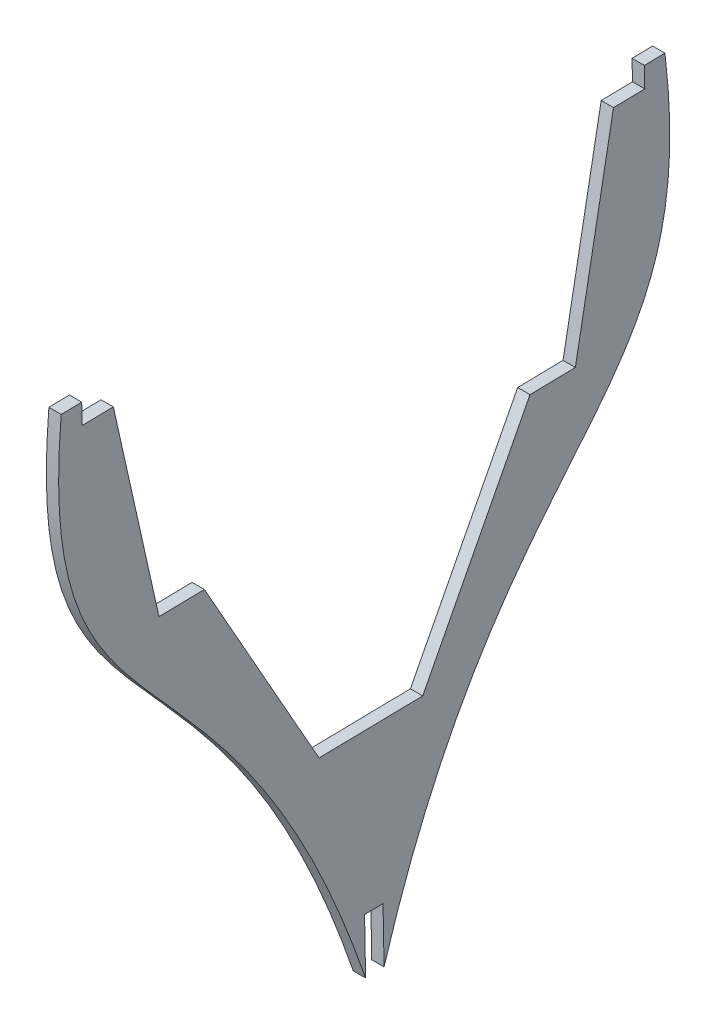
ISO-10303-21;
HEADER;
FILE_DESCRIPTION(('STEP AP214'),'2;1');
FILE_NAME('part.step','',(''),(''),'','','');
FILE_SCHEMA(('AUTOMOTIVE_DESIGN { 1 0 10303 214 1 1 1 1 }'));
ENDSEC;
DATA;
#1=APPLICATION_CONTEXT('core data for automotive mechanical design processes');
#2=APPLICATION_PROTOCOL_DEFINITION('international standard','automotive_design',2000,#1);
#3=PRODUCT_CONTEXT('',#1,'mechanical');
#4=PRODUCT('Part','Part','',(#3));
#5=PRODUCT_RELATED_PRODUCT_CATEGORY('part','',(#4));
#6=PRODUCT_DEFINITION_FORMATION('','',#4);
#7=PRODUCT_DEFINITION_CONTEXT('part definition',#1,'design');
#8=PRODUCT_DEFINITION('design','',#6,#7);
#9=PRODUCT_DEFINITION_SHAPE('','',#8);
#10=(LENGTH_UNIT() NAMED_UNIT(*) SI_UNIT(.MILLI.,.METRE.));
#11=(NAMED_UNIT(*) PLANE_ANGLE_UNIT() SI_UNIT($,.RADIAN.));
#12=(NAMED_UNIT(*) SI_UNIT($,.STERADIAN.) SOLID_ANGLE_UNIT());
#13=UNCERTAINTY_MEASURE_WITH_UNIT(LENGTH_MEASURE(1.E-05),#10,'distance_accuracy_value','');
#14=(GEOMETRIC_REPRESENTATION_CONTEXT(3) GLOBAL_UNCERTAINTY_ASSIGNED_CONTEXT((#13)) GLOBAL_UNIT_ASSIGNED_CONTEXT((#10,
#11,#12)) REPRESENTATION_CONTEXT('',''));
#15=CARTESIAN_POINT('',(0.,0.,0.));
#16=DIRECTION('',(0.,0.,1.));
#17=DIRECTION('',(1.,0.,0.));
#18=AXIS2_PLACEMENT_3D('',#15,#16,#17);
#19=CARTESIAN_POINT('',(6.,355.378099814602,153.581088809541));
#20=CARTESIAN_POINT('',(6.,198.734001520713,166.999417296448));
#21=CARTESIAN_POINT('',(6.,241.756512810065,68.4977827661735));
#22=CARTESIAN_POINT('',(6.,29.1018574836291,0.530415896047852));
#23=B_SPLINE_CURVE_WITH_KNOTS('',3,(#19,#20,#21,#22),.UNSPECIFIED.,.F.,.F.,(4,4),(0.,1.),.UNSPECIFIED.);
#24=DIRECTION('',(-1.,0.,0.));
#25=VECTOR('',#24,1.);
#26=SURFACE_OF_LINEAR_EXTRUSION('',#23,#25);
#27=CARTESIAN_POINT('',(0.,355.378099814602,153.581088809541));
#28=CARTESIAN_POINT('',(0.,198.734001520713,166.999417296448));
#29=CARTESIAN_POINT('',(0.,241.756512810065,68.4977827661735));
#30=CARTESIAN_POINT('',(0.,29.1018574836291,0.530415896047852));
#31=B_SPLINE_CURVE_WITH_KNOTS('',3,(#27,#28,#29,#30),.UNSPECIFIED.,.F.,.F.,(4,4),(0.,1.),.UNSPECIFIED.);
#32=CARTESIAN_POINT('',(0.,355.378099814602,153.581088809541));
#33=VERTEX_POINT('',#32);
#34=CARTESIAN_POINT('',(0.,43.4519092016995,5.29345749439015));
#35=VERTEX_POINT('',#34);
#36=EDGE_CURVE('E179',#33,#35,#31,.T.);
#37=ORIENTED_EDGE('',*,*,#36,.T.);
#38=DIRECTION('',(1.,0.,0.));
#39=VECTOR('',#38,1.);
#40=CARTESIAN_POINT('',(0.,43.4519092016995,5.29345749439015));
#41=LINE('',#40,#39);
#42=CARTESIAN_POINT('',(6.,43.4519092016995,5.29345749439015));
#43=VERTEX_POINT('',#42);
#44=EDGE_CURVE('E185',#35,#43,#41,.T.);
#45=ORIENTED_EDGE('',*,*,#44,.T.);
#46=CARTESIAN_POINT('',(6.,355.378099814602,153.581088809541));
#47=VERTEX_POINT('',#46);
#48=EDGE_CURVE('E219',#47,#43,#23,.T.);
#49=ORIENTED_EDGE('',*,*,#48,.F.);
#50=DIRECTION('',(-1.,0.,0.));
#51=VECTOR('',#50,1.);
#52=CARTESIAN_POINT('',(6.,355.378099814602,153.581088809541));
#53=LINE('',#52,#51);
#54=EDGE_CURVE('E175',#47,#33,#53,.T.);
#55=ORIENTED_EDGE('',*,*,#54,.T.);
#56=EDGE_LOOP('',(#37,#45,#49,#55));
#57=FACE_BOUND('',#56,.T.);
#58=ADVANCED_FACE('F33',(#57),#26,.F.);
#59=CARTESIAN_POINT('',(6.,29.1018574836291,0.530415896047852));
#60=CARTESIAN_POINT('',(6.,244.092023687061,-59.6426164945832));
#61=CARTESIAN_POINT('',(6.,204.687512569235,-159.646581347699));
#62=CARTESIAN_POINT('',(6.,360.738605502558,-140.529011836815));
#63=B_SPLINE_CURVE_WITH_KNOTS('',3,(#59,#60,#61,#62),.UNSPECIFIED.,.F.,.F.,(4,4),(0.,1.),.UNSPECIFIED.);
#64=DIRECTION('',(-1.,0.,0.));
#65=VECTOR('',#64,1.);
#66=SURFACE_OF_LINEAR_EXTRUSION('',#63,#65);
#67=CARTESIAN_POINT('',(6.,43.6159448845461,-3.70654250560984));
#68=VERTEX_POINT('',#67);
#69=CARTESIAN_POINT('',(6.,360.738605502558,-140.529011836815));
#70=VERTEX_POINT('',#69);
#71=EDGE_CURVE('E116',#68,#70,#63,.T.);
#72=ORIENTED_EDGE('',*,*,#71,.F.);
#73=DIRECTION('',(1.,0.,0.));
#74=VECTOR('',#73,1.);
#75=CARTESIAN_POINT('',(0.,43.6159448845461,-3.70654250560984));
#76=LINE('',#75,#74);
#77=CARTESIAN_POINT('',(0.,43.6159448845461,-3.70654250560984));
#78=VERTEX_POINT('',#77);
#79=EDGE_CURVE('E311',#78,#68,#76,.T.);
#80=ORIENTED_EDGE('',*,*,#79,.F.);
#81=CARTESIAN_POINT('',(0.,29.1018574836291,0.530415896047852));
#82=CARTESIAN_POINT('',(0.,244.092023687061,-59.6426164945832));
#83=CARTESIAN_POINT('',(0.,204.687512569235,-159.646581347699));
#84=CARTESIAN_POINT('',(0.,360.738605502558,-140.529011836815));
#85=B_SPLINE_CURVE_WITH_KNOTS('',3,(#81,#82,#83,#84),.UNSPECIFIED.,.F.,.F.,(4,4),(0.,1.),.UNSPECIFIED.);
#86=CARTESIAN_POINT('',(0.,360.738605502558,-140.529011836815));
#87=VERTEX_POINT('',#86);
#88=EDGE_CURVE('E184',#78,#87,#85,.T.);
#89=ORIENTED_EDGE('',*,*,#88,.T.);
#90=DIRECTION('',(-1.,0.,0.));
#91=VECTOR('',#90,1.);
#92=CARTESIAN_POINT('',(6.,360.738605502558,-140.529011836815));
#93=LINE('',#92,#91);
#94=EDGE_CURVE('E11',#70,#87,#93,.T.);
#95=ORIENTED_EDGE('',*,*,#94,.F.);
#96=EDGE_LOOP('',(#72,#80,#89,#95));
#97=FACE_BOUND('',#96,.T.);
#98=ADVANCED_FACE('F323',(#97),#66,.F.);
#99=CARTESIAN_POINT('',(6.,360.738605502558,-140.529011836815));
#100=DIRECTION('',(0.,-0.999833944424872,-0.0182231604229995));
#101=DIRECTION('',(0.,0.0182231604229995,-0.999833944424872));
#102=AXIS2_PLACEMENT_3D('',#99,#100,#101);
#103=PLANE('',#102);
#104=DIRECTION('',(0.,-0.0182231604229995,0.999833944424872));
#105=VECTOR('',#104,1.);
#106=CARTESIAN_POINT('',(0.,360.738605502558,-140.529011836815));
#107=LINE('',#106,#105);
#108=CARTESIAN_POINT('',(0.,360.556343632728,-130.529011836815));
#109=VERTEX_POINT('',#108);
#110=EDGE_CURVE('E192',#87,#109,#107,.T.);
#111=ORIENTED_EDGE('',*,*,#110,.T.);
#112=DIRECTION('',(-1.,0.,0.));
#113=VECTOR('',#112,1.);
#114=CARTESIAN_POINT('',(6.,360.556343632728,-130.529011836815));
#115=LINE('',#114,#113);
#116=CARTESIAN_POINT('',(6.,360.556343632728,-130.529011836815));
#117=VERTEX_POINT('',#116);
#118=EDGE_CURVE('E41',#117,#109,#115,.T.);
#119=ORIENTED_EDGE('',*,*,#118,.F.);
#120=DIRECTION('',(0.,-0.0182231604229995,0.999833944424872));
#121=VECTOR('',#120,1.);
#122=CARTESIAN_POINT('',(6.,360.738605502558,-140.529011836815));
#123=LINE('',#122,#121);
#124=EDGE_CURVE('E305',#70,#117,#123,.T.);
#125=ORIENTED_EDGE('',*,*,#124,.F.);
#126=ORIENTED_EDGE('',*,*,#94,.T.);
#127=EDGE_LOOP('',(#111,#119,#125,#126));
#128=FACE_BOUND('',#127,.T.);
#129=ADVANCED_FACE('F326',(#128),#103,.F.);
#130=CARTESIAN_POINT('',(6.,360.556343632728,-130.529011836815));
#131=DIRECTION('',(0.,0.0182231604229912,-0.999833944424872));
#132=DIRECTION('',(0.,0.999833944424872,0.0182231604229912));
#133=AXIS2_PLACEMENT_3D('',#130,#131,#132);
#134=PLANE('',#133);
#135=DIRECTION('',(0.,-0.999833944424872,-0.0182231604229912));
#136=VECTOR('',#135,1.);
#137=CARTESIAN_POINT('',(0.,360.556343632728,-130.529011836815));
#138=LINE('',#137,#136);
#139=CARTESIAN_POINT('',(0.,350.556343632728,-130.711273706644));
#140=VERTEX_POINT('',#139);
#141=EDGE_CURVE('E197',#109,#140,#138,.T.);
#142=ORIENTED_EDGE('',*,*,#141,.T.);
#143=DIRECTION('',(-1.,0.,0.));
#144=VECTOR('',#143,1.);
#145=CARTESIAN_POINT('',(6.,350.556343632728,-130.711273706644));
#146=LINE('',#145,#144);
#147=CARTESIAN_POINT('',(6.,350.556343632728,-130.711273706644));
#148=VERTEX_POINT('',#147);
#149=EDGE_CURVE('E244',#148,#140,#146,.T.);
#150=ORIENTED_EDGE('',*,*,#149,.F.);
#151=DIRECTION('',(0.,-0.999833944424872,-0.0182231604229912));
#152=VECTOR('',#151,1.);
#153=CARTESIAN_POINT('',(6.,360.556343632728,-130.529011836815));
#154=LINE('',#153,#152);
#155=EDGE_CURVE('E253',#117,#148,#154,.T.);
#156=ORIENTED_EDGE('',*,*,#155,.F.);
#157=ORIENTED_EDGE('',*,*,#118,.T.);
#158=EDGE_LOOP('',(#142,#150,#156,#157));
#159=FACE_BOUND('',#158,.T.);
#160=ADVANCED_FACE('F251',(#159),#134,.F.);
#161=CARTESIAN_POINT('',(6.,350.556343632728,-130.711273706644));
#162=DIRECTION('',(0.,-0.999833944424872,-0.0182231604229842));
#163=DIRECTION('',(0.,0.0182231604229842,-0.999833944424872));
#164=AXIS2_PLACEMENT_3D('',#161,#162,#163);
#165=PLANE('',#164);
#166=DIRECTION('',(0.,-0.0182231604229842,0.999833944424872));
#167=VECTOR('',#166,1.);
#168=CARTESIAN_POINT('',(0.,350.556343632728,-130.711273706644));
#169=LINE('',#168,#167);
#170=CARTESIAN_POINT('',(0.,350.278767510279,-115.481751332674));
#171=VERTEX_POINT('',#170);
#172=EDGE_CURVE('E199',#140,#171,#169,.T.);
#173=ORIENTED_EDGE('',*,*,#172,.T.);
#174=DIRECTION('',(-1.,0.,0.));
#175=VECTOR('',#174,1.);
#176=CARTESIAN_POINT('',(6.,350.278767510279,-115.481751332674));
#177=LINE('',#176,#175);
#178=CARTESIAN_POINT('',(6.,350.278767510279,-115.481751332674));
#179=VERTEX_POINT('',#178);
#180=EDGE_CURVE('E241',#179,#171,#177,.T.);
#181=ORIENTED_EDGE('',*,*,#180,.F.);
#182=DIRECTION('',(0.,-0.0182231604229842,0.999833944424872));
#183=VECTOR('',#182,1.);
#184=CARTESIAN_POINT('',(6.,350.556343632728,-130.711273706644));
#185=LINE('',#184,#183);
#186=EDGE_CURVE('E275',#148,#179,#185,.T.);
#187=ORIENTED_EDGE('',*,*,#186,.F.);
#188=ORIENTED_EDGE('',*,*,#149,.T.);
#189=EDGE_LOOP('',(#173,#181,#187,#188));
#190=FACE_BOUND('',#189,.T.);
#191=ADVANCED_FACE('F266',(#190),#165,.F.);
#192=CARTESIAN_POINT('',(6.,350.278767510279,-115.481751332674));
#193=DIRECTION('',(0.,-0.182055173192639,-0.983288316778857));
#194=DIRECTION('',(0.,0.983288316778857,-0.182055173192639));
#195=AXIS2_PLACEMENT_3D('',#192,#193,#194);
#196=PLANE('',#195);
#197=DIRECTION('',(0.,-0.983288316778857,0.182055173192639));
#198=VECTOR('',#197,1.);
#199=CARTESIAN_POINT('',(0.,350.278767510279,-115.481751332674));
#200=LINE('',#199,#198);
#201=CARTESIAN_POINT('',(0.,249.923503702483,-96.9010414619696));
#202=VERTEX_POINT('',#201);
#203=EDGE_CURVE('E201',#171,#202,#200,.T.);
#204=ORIENTED_EDGE('',*,*,#203,.T.);
#205=DIRECTION('',(-1.,0.,0.));
#206=VECTOR('',#205,1.);
#207=CARTESIAN_POINT('',(6.,249.923503702483,-96.9010414619696));
#208=LINE('',#207,#206);
#209=CARTESIAN_POINT('',(6.,249.923503702483,-96.9010414619696));
#210=VERTEX_POINT('',#209);
#211=EDGE_CURVE('E238',#210,#202,#208,.T.);
#212=ORIENTED_EDGE('',*,*,#211,.F.);
#213=DIRECTION('',(0.,-0.983288316778857,0.182055173192639));
#214=VECTOR('',#213,1.);
#215=CARTESIAN_POINT('',(6.,350.278767510279,-115.481751332674));
#216=LINE('',#215,#214);
#217=EDGE_CURVE('E272',#179,#210,#216,.T.);
#218=ORIENTED_EDGE('',*,*,#217,.F.);
#219=ORIENTED_EDGE('',*,*,#180,.T.);
#220=EDGE_LOOP('',(#204,#212,#218,#219));
#221=FACE_BOUND('',#220,.T.);
#222=ADVANCED_FACE('F270',(#221),#196,.F.);
#223=CARTESIAN_POINT('',(6.,249.923503702483,-96.9010414619696));
#224=DIRECTION('',(0.,-0.999833944424872,-0.0182231604229948));
#225=DIRECTION('',(0.,0.0182231604229948,-0.999833944424872));
#226=AXIS2_PLACEMENT_3D('',#223,#224,#225);
#227=PLANE('',#226);
#228=DIRECTION('',(0.,-0.0182231604229948,0.999833944424872));
#229=VECTOR('',#228,1.);
#230=CARTESIAN_POINT('',(0.,249.923503702483,-96.9010414619696));
#231=LINE('',#230,#229);
#232=CARTESIAN_POINT('',(0.,249.520283779664,-74.7779323773996));
#233=VERTEX_POINT('',#232);
#234=EDGE_CURVE('E203',#202,#233,#231,.T.);
#235=ORIENTED_EDGE('',*,*,#234,.T.);
#236=DIRECTION('',(-1.,0.,0.));
#237=VECTOR('',#236,1.);
#238=CARTESIAN_POINT('',(6.,249.520283779664,-74.7779323773996));
#239=LINE('',#238,#237);
#240=CARTESIAN_POINT('',(6.,249.520283779664,-74.7779323773996));
#241=VERTEX_POINT('',#240);
#242=EDGE_CURVE('E235',#241,#233,#239,.T.);
#243=ORIENTED_EDGE('',*,*,#242,.F.);
#244=DIRECTION('',(0.,-0.0182231604229948,0.999833944424872));
#245=VECTOR('',#244,1.);
#246=CARTESIAN_POINT('',(6.,249.923503702483,-96.9010414619696));
#247=LINE('',#246,#245);
#248=EDGE_CURVE('E274',#210,#241,#247,.T.);
#249=ORIENTED_EDGE('',*,*,#248,.F.);
#250=ORIENTED_EDGE('',*,*,#211,.T.);
#251=EDGE_LOOP('',(#235,#243,#249,#250));
#252=FACE_BOUND('',#251,.T.);
#253=ADVANCED_FACE('F336',(#252),#227,.F.);
#254=CARTESIAN_POINT('',(6.,249.520283779664,-74.7779323773996));
#255=DIRECTION('',(0.,-0.45948594700903,-0.888185039561698));
#256=DIRECTION('',(0.,0.888185039561698,-0.45948594700903));
#257=AXIS2_PLACEMENT_3D('',#254,#255,#256);
#258=PLANE('',#257);
#259=DIRECTION('',(0.,-0.888185039561698,0.45948594700903));
#260=VECTOR('',#259,1.);
#261=CARTESIAN_POINT('',(0.,249.520283779664,-74.7779323773996));
#262=LINE('',#261,#260);
#263=CARTESIAN_POINT('',(0.,148.551644431954,-22.5436919855662));
#264=VERTEX_POINT('',#263);
#265=EDGE_CURVE('E205',#233,#264,#262,.T.);
#266=ORIENTED_EDGE('',*,*,#265,.T.);
#267=DIRECTION('',(-1.,0.,0.));
#268=VECTOR('',#267,1.);
#269=CARTESIAN_POINT('',(6.,148.551644431954,-22.5436919855662));
#270=LINE('',#269,#268);
#271=CARTESIAN_POINT('',(6.,148.551644431954,-22.5436919855662));
#272=VERTEX_POINT('',#271);
#273=EDGE_CURVE('E232',#272,#264,#270,.T.);
#274=ORIENTED_EDGE('',*,*,#273,.F.);
#275=DIRECTION('',(0.,-0.888185039561698,0.45948594700903));
#276=VECTOR('',#275,1.);
#277=CARTESIAN_POINT('',(6.,249.520283779664,-74.7779323773996));
#278=LINE('',#277,#276);
#279=EDGE_CURVE('E277',#241,#272,#278,.T.);
#280=ORIENTED_EDGE('',*,*,#279,.F.);
#281=ORIENTED_EDGE('',*,*,#242,.T.);
#282=EDGE_LOOP('',(#266,#274,#280,#281));
#283=FACE_BOUND('',#282,.T.);
#284=ADVANCED_FACE('F339',(#283),#258,.F.);
#285=CARTESIAN_POINT('',(6.,147.631483115258,27.9419810494372));
#286=DIRECTION('',(0.,-0.999833944424872,-0.0182231604229889));
#287=DIRECTION('',(0.,0.0182231604229889,-0.999833944424872));
#288=AXIS2_PLACEMENT_3D('',#285,#286,#287);
#289=PLANE('',#288);
#290=DIRECTION('',(0.,-0.0182231604229889,0.999833944424872));
#291=VECTOR('',#290,1.);
#292=CARTESIAN_POINT('',(0.,147.631483115258,27.9419810494372));
#293=LINE('',#292,#291);
#294=CARTESIAN_POINT('',(0.,147.631483115258,27.9419810494372));
#295=VERTEX_POINT('',#294);
#296=EDGE_CURVE('E207',#264,#295,#293,.T.);
#297=ORIENTED_EDGE('',*,*,#296,.T.);
#298=DIRECTION('',(-1.,0.,0.));
#299=VECTOR('',#298,1.);
#300=CARTESIAN_POINT('',(6.,147.631483115258,27.9419810494372));
#301=LINE('',#300,#299);
#302=CARTESIAN_POINT('',(6.,147.631483115258,27.9419810494372));
#303=VERTEX_POINT('',#302);
#304=EDGE_CURVE('E229',#303,#295,#301,.T.);
#305=ORIENTED_EDGE('',*,*,#304,.F.);
#306=DIRECTION('',(0.,-0.0182231604229889,0.999833944424872));
#307=VECTOR('',#306,1.);
#308=CARTESIAN_POINT('',(6.,147.631483115258,27.9419810494372));
#309=LINE('',#308,#307);
#310=EDGE_CURVE('E283',#272,#303,#309,.T.);
#311=ORIENTED_EDGE('',*,*,#310,.F.);
#312=ORIENTED_EDGE('',*,*,#273,.T.);
#313=EDGE_LOOP('',(#297,#305,#311,#312));
#314=FACE_BOUND('',#313,.T.);
#315=ADVANCED_FACE('F343',(#314),#289,.F.);
#316=CARTESIAN_POINT('',(6.,246.629632652522,83.8208535258687));
#317=DIRECTION('',(0.,-0.491546473061073,0.870851344846651));
#318=DIRECTION('',(0.,-0.870851344846651,-0.491546473061073));
#319=AXIS2_PLACEMENT_3D('',#316,#317,#318);
#320=PLANE('',#319);
#321=DIRECTION('',(0.,0.870851344846651,0.491546473061073));
#322=VECTOR('',#321,1.);
#323=CARTESIAN_POINT('',(0.,246.629632652522,83.8208535258687));
#324=LINE('',#323,#322);
#325=CARTESIAN_POINT('',(0.,246.629632652522,83.8208535258687));
#326=VERTEX_POINT('',#325);
#327=EDGE_CURVE('E209',#295,#326,#324,.T.);
#328=ORIENTED_EDGE('',*,*,#327,.T.);
#329=DIRECTION('',(-1.,0.,0.));
#330=VECTOR('',#329,1.);
#331=CARTESIAN_POINT('',(6.,246.629632652522,83.8208535258687));
#332=LINE('',#331,#330);
#333=CARTESIAN_POINT('',(6.,246.629632652522,83.8208535258687));
#334=VERTEX_POINT('',#333);
#335=EDGE_CURVE('E226',#334,#326,#332,.T.);
#336=ORIENTED_EDGE('',*,*,#335,.F.);
#337=DIRECTION('',(0.,0.870851344846651,0.491546473061073));
#338=VECTOR('',#337,1.);
#339=CARTESIAN_POINT('',(6.,246.629632652522,83.8208535258687));
#340=LINE('',#339,#338);
#341=EDGE_CURVE('E285',#303,#334,#340,.T.);
#342=ORIENTED_EDGE('',*,*,#341,.F.);
#343=ORIENTED_EDGE('',*,*,#304,.T.);
#344=EDGE_LOOP('',(#328,#336,#342,#343));
#345=FACE_BOUND('',#344,.T.);
#346=ADVANCED_FACE('F347',(#345),#320,.F.);
#347=CARTESIAN_POINT('',(6.,246.226412729702,105.943962610439));
#348=DIRECTION('',(0.,-0.999833944424872,-0.0182231604229898));
#349=DIRECTION('',(0.,0.0182231604229898,-0.999833944424872));
#350=AXIS2_PLACEMENT_3D('',#347,#348,#349);
#351=PLANE('',#350);
#352=DIRECTION('',(0.,-0.0182231604229898,0.999833944424872));
#353=VECTOR('',#352,1.);
#354=CARTESIAN_POINT('',(0.,246.226412729702,105.943962610439));
#355=LINE('',#354,#353);
#356=CARTESIAN_POINT('',(0.,246.226412729702,105.943962610439));
#357=VERTEX_POINT('',#356);
#358=EDGE_CURVE('E211',#326,#357,#355,.T.);
#359=ORIENTED_EDGE('',*,*,#358,.T.);
#360=DIRECTION('',(-1.,0.,0.));
#361=VECTOR('',#360,1.);
#362=CARTESIAN_POINT('',(6.,246.226412729702,105.943962610439));
#363=LINE('',#362,#361);
#364=CARTESIAN_POINT('',(6.,246.226412729702,105.943962610439));
#365=VERTEX_POINT('',#364);
#366=EDGE_CURVE('E223',#365,#357,#363,.T.);
#367=ORIENTED_EDGE('',*,*,#366,.F.);
#368=DIRECTION('',(0.,-0.0182231604229898,0.999833944424872));
#369=VECTOR('',#368,1.);
#370=CARTESIAN_POINT('',(6.,246.226412729702,105.943962610439));
#371=LINE('',#370,#369);
#372=EDGE_CURVE('E287',#334,#365,#371,.T.);
#373=ORIENTED_EDGE('',*,*,#372,.F.);
#374=ORIENTED_EDGE('',*,*,#335,.T.);
#375=EDGE_LOOP('',(#359,#367,#373,#374));
#376=FACE_BOUND('',#375,.T.);
#377=ADVANCED_FACE('F293',(#376),#351,.F.);
#378=CARTESIAN_POINT('',(6.,345.837937806881,128.169304565741));
#379=DIRECTION('',(0.,-0.217765548630507,0.97600110954325));
#380=DIRECTION('',(0.,-0.97600110954325,-0.217765548630507));
#381=AXIS2_PLACEMENT_3D('',#378,#379,#380);
#382=PLANE('',#381);
#383=DIRECTION('',(0.,0.97600110954325,0.217765548630507));
#384=VECTOR('',#383,1.);
#385=CARTESIAN_POINT('',(0.,345.837937806881,128.169304565741));
#386=LINE('',#385,#384);
#387=CARTESIAN_POINT('',(0.,345.837937806881,128.169304565741));
#388=VERTEX_POINT('',#387);
#389=EDGE_CURVE('E213',#357,#388,#386,.T.);
#390=ORIENTED_EDGE('',*,*,#389,.T.);
#391=DIRECTION('',(-1.,0.,0.));
#392=VECTOR('',#391,1.);
#393=CARTESIAN_POINT('',(6.,345.837937806881,128.169304565741));
#394=LINE('',#393,#392);
#395=CARTESIAN_POINT('',(6.,345.837937806881,128.169304565741));
#396=VERTEX_POINT('',#395);
#397=EDGE_CURVE('E170',#396,#388,#394,.T.);
#398=ORIENTED_EDGE('',*,*,#397,.F.);
#399=DIRECTION('',(0.,0.97600110954325,0.217765548630507));
#400=VECTOR('',#399,1.);
#401=CARTESIAN_POINT('',(6.,345.837937806881,128.169304565741));
#402=LINE('',#401,#400);
#403=EDGE_CURVE('E158',#365,#396,#402,.T.);
#404=ORIENTED_EDGE('',*,*,#403,.F.);
#405=ORIENTED_EDGE('',*,*,#366,.T.);
#406=EDGE_LOOP('',(#390,#398,#404,#405));
#407=FACE_BOUND('',#406,.T.);
#408=ADVANCED_FACE('F297',(#407),#382,.F.);
#409=CARTESIAN_POINT('',(6.,345.560361684432,143.398826939711));
#410=DIRECTION('',(0.,-0.999833944424872,-0.0182231604229915));
#411=DIRECTION('',(0.,0.0182231604229915,-0.999833944424872));
#412=AXIS2_PLACEMENT_3D('',#409,#410,#411);
#413=PLANE('',#412);
#414=DIRECTION('',(0.,-0.0182231604229915,0.999833944424872));
#415=VECTOR('',#414,1.);
#416=CARTESIAN_POINT('',(0.,345.560361684432,143.398826939711));
#417=LINE('',#416,#415);
#418=CARTESIAN_POINT('',(0.,345.560361684432,143.398826939711));
#419=VERTEX_POINT('',#418);
#420=EDGE_CURVE('E167',#388,#419,#417,.T.);
#421=ORIENTED_EDGE('',*,*,#420,.T.);
#422=DIRECTION('',(-1.,0.,0.));
#423=VECTOR('',#422,1.);
#424=CARTESIAN_POINT('',(6.,345.560361684432,143.398826939711));
#425=LINE('',#424,#423);
#426=CARTESIAN_POINT('',(6.,345.560361684432,143.398826939711));
#427=VERTEX_POINT('',#426);
#428=EDGE_CURVE('E164',#427,#419,#425,.T.);
#429=ORIENTED_EDGE('',*,*,#428,.F.);
#430=DIRECTION('',(0.,-0.0182231604229915,0.999833944424872));
#431=VECTOR('',#430,1.);
#432=CARTESIAN_POINT('',(6.,345.560361684432,143.398826939711));
#433=LINE('',#432,#431);
#434=EDGE_CURVE('E151',#396,#427,#433,.T.);
#435=ORIENTED_EDGE('',*,*,#434,.F.);
#436=ORIENTED_EDGE('',*,*,#397,.T.);
#437=EDGE_LOOP('',(#421,#429,#435,#436));
#438=FACE_BOUND('',#437,.T.);
#439=ADVANCED_FACE('F165',(#438),#413,.F.);
#440=CARTESIAN_POINT('',(6.,355.560361684432,143.581088809541));
#441=DIRECTION('',(0.,-0.0182231604229912,0.999833944424872));
#442=DIRECTION('',(0.,-0.999833944424872,-0.0182231604229912));
#443=AXIS2_PLACEMENT_3D('',#440,#441,#442);
#444=PLANE('',#443);
#445=DIRECTION('',(0.,0.999833944424872,0.0182231604229912));
#446=VECTOR('',#445,1.);
#447=CARTESIAN_POINT('',(0.,355.560361684432,143.581088809541));
#448=LINE('',#447,#446);
#449=CARTESIAN_POINT('',(0.,355.560361684432,143.581088809541));
#450=VERTEX_POINT('',#449);
#451=EDGE_CURVE('E216',#419,#450,#448,.T.);
#452=ORIENTED_EDGE('',*,*,#451,.T.);
#453=DIRECTION('',(-1.,0.,0.));
#454=VECTOR('',#453,1.);
#455=CARTESIAN_POINT('',(6.,355.560361684432,143.581088809541));
#456=LINE('',#455,#454);
#457=CARTESIAN_POINT('',(6.,355.560361684432,143.581088809541));
#458=VERTEX_POINT('',#457);
#459=EDGE_CURVE('E171',#458,#450,#456,.T.);
#460=ORIENTED_EDGE('',*,*,#459,.F.);
#461=DIRECTION('',(0.,0.999833944424872,0.0182231604229912));
#462=VECTOR('',#461,1.);
#463=CARTESIAN_POINT('',(6.,355.560361684432,143.581088809541));
#464=LINE('',#463,#462);
#465=EDGE_CURVE('E155',#427,#458,#464,.T.);
#466=ORIENTED_EDGE('',*,*,#465,.F.);
#467=ORIENTED_EDGE('',*,*,#428,.T.);
#468=EDGE_LOOP('',(#452,#460,#466,#467));
#469=FACE_BOUND('',#468,.T.);
#470=ADVANCED_FACE('F173',(#469),#444,.F.);
#471=CARTESIAN_POINT('',(6.,355.378099814602,153.581088809541));
#472=DIRECTION('',(0.,-0.999833944424872,-0.0182231604229884));
#473=DIRECTION('',(0.,0.0182231604229885,-0.999833944424872));
#474=AXIS2_PLACEMENT_3D('',#471,#472,#473);
#475=PLANE('',#474);
#476=DIRECTION('',(0.,-0.0182231604229884,0.999833944424872));
#477=VECTOR('',#476,1.);
#478=CARTESIAN_POINT('',(0.,355.378099814602,153.581088809541));
#479=LINE('',#478,#477);
#480=EDGE_CURVE('E108',#450,#33,#479,.T.);
#481=ORIENTED_EDGE('',*,*,#480,.T.);
#482=ORIENTED_EDGE('',*,*,#54,.F.);
#483=DIRECTION('',(0.,-0.0182231604229884,0.999833944424872));
#484=VECTOR('',#483,1.);
#485=CARTESIAN_POINT('',(6.,355.378099814602,153.581088809541));
#486=LINE('',#485,#484);
#487=EDGE_CURVE('E57',#458,#47,#486,.T.);
#488=ORIENTED_EDGE('',*,*,#487,.F.);
#489=ORIENTED_EDGE('',*,*,#459,.T.);
#490=EDGE_LOOP('',(#481,#482,#488,#489));
#491=FACE_BOUND('',#490,.T.);
#492=ADVANCED_FACE('F299',(#491),#475,.F.);
#493=CARTESIAN_POINT('',(6.,213.243937536321,107.575388111682));
#494=DIRECTION('',(-1.,0.,0.));
#495=DIRECTION('',(0.,0.,1.));
#496=AXIS2_PLACEMENT_3D('',#493,#494,#495);
#497=PLANE('',#496);
#498=ORIENTED_EDGE('',*,*,#48,.T.);
#499=DIRECTION('',(0.,-0.999833944424872,-0.0182231604229893));
#500=VECTOR('',#499,1.);
#501=CARTESIAN_POINT('',(6.,43.4519092016995,5.29345749439015));
#502=LINE('',#501,#500);
#503=CARTESIAN_POINT('',(6.,70.4519092016995,5.78556454292983));
#504=VERTEX_POINT('',#503);
#505=EDGE_CURVE('E499',#504,#43,#502,.T.);
#506=ORIENTED_EDGE('',*,*,#505,.F.);
#507=DIRECTION('',(0.,-0.0182231604229897,0.999833944424872));
#508=VECTOR('',#507,1.);
#509=CARTESIAN_POINT('',(6.,70.4519092016995,5.78556454292983));
#510=LINE('',#509,#508);
#511=CARTESIAN_POINT('',(6.,70.6159448845461,-3.21443545707017));
#512=VERTEX_POINT('',#511);
#513=EDGE_CURVE('E507',#512,#504,#510,.T.);
#514=ORIENTED_EDGE('',*,*,#513,.F.);
#515=DIRECTION('',(0.,0.999833944424872,0.0182231604229891));
#516=VECTOR('',#515,1.);
#517=CARTESIAN_POINT('',(6.,70.6159448845461,-3.21443545707017));
#518=LINE('',#517,#516);
#519=EDGE_CURVE('E511',#68,#512,#518,.T.);
#520=ORIENTED_EDGE('',*,*,#519,.F.);
#521=ORIENTED_EDGE('',*,*,#71,.T.);
#522=ORIENTED_EDGE('',*,*,#124,.T.);
#523=ORIENTED_EDGE('',*,*,#155,.T.);
#524=ORIENTED_EDGE('',*,*,#186,.T.);
#525=ORIENTED_EDGE('',*,*,#217,.T.);
#526=ORIENTED_EDGE('',*,*,#248,.T.);
#527=ORIENTED_EDGE('',*,*,#279,.T.);
#528=ORIENTED_EDGE('',*,*,#310,.T.);
#529=ORIENTED_EDGE('',*,*,#341,.T.);
#530=ORIENTED_EDGE('',*,*,#372,.T.);
#531=ORIENTED_EDGE('',*,*,#403,.T.);
#532=ORIENTED_EDGE('',*,*,#434,.T.);
#533=ORIENTED_EDGE('',*,*,#465,.T.);
#534=ORIENTED_EDGE('',*,*,#487,.T.);
#535=EDGE_LOOP('',(#498,#506,#514,#520,#521,#522,#523,#524,#525,#526,#527,#528,#529,#530,#531,
#532,#533,#534));
#536=FACE_BOUND('',#535,.T.);
#537=ADVANCED_FACE('F153',(#536),#497,.F.);
#538=CARTESIAN_POINT('',(0.,213.243937536321,107.575388111682));
#539=DIRECTION('',(-1.,0.,0.));
#540=DIRECTION('',(0.,0.,1.));
#541=AXIS2_PLACEMENT_3D('',#538,#539,#540);
#542=PLANE('',#541);
#543=DIRECTION('',(0.,-0.999833944424872,-0.0182231604229893));
#544=VECTOR('',#543,1.);
#545=CARTESIAN_POINT('',(0.,43.4519092016995,5.29345749439015));
#546=LINE('',#545,#544);
#547=CARTESIAN_POINT('',(0.,70.4519092016995,5.78556454292983));
#548=VERTEX_POINT('',#547);
#549=EDGE_CURVE('E520',#548,#35,#546,.T.);
#550=ORIENTED_EDGE('',*,*,#549,.T.);
#551=ORIENTED_EDGE('',*,*,#36,.F.);
#552=ORIENTED_EDGE('',*,*,#480,.F.);
#553=ORIENTED_EDGE('',*,*,#451,.F.);
#554=ORIENTED_EDGE('',*,*,#420,.F.);
#555=ORIENTED_EDGE('',*,*,#389,.F.);
#556=ORIENTED_EDGE('',*,*,#358,.F.);
#557=ORIENTED_EDGE('',*,*,#327,.F.);
#558=ORIENTED_EDGE('',*,*,#296,.F.);
#559=ORIENTED_EDGE('',*,*,#265,.F.);
#560=ORIENTED_EDGE('',*,*,#234,.F.);
#561=ORIENTED_EDGE('',*,*,#203,.F.);
#562=ORIENTED_EDGE('',*,*,#172,.F.);
#563=ORIENTED_EDGE('',*,*,#141,.F.);
#564=ORIENTED_EDGE('',*,*,#110,.F.);
#565=ORIENTED_EDGE('',*,*,#88,.F.);
#566=DIRECTION('',(0.,0.999833944424872,0.0182231604229891));
#567=VECTOR('',#566,1.);
#568=CARTESIAN_POINT('',(0.,70.6159448845461,-3.21443545707017));
#569=LINE('',#568,#567);
#570=CARTESIAN_POINT('',(0.,70.6159448845461,-3.21443545707014));
#571=VERTEX_POINT('',#570);
#572=EDGE_CURVE('E506',#78,#571,#569,.T.);
#573=ORIENTED_EDGE('',*,*,#572,.T.);
#574=DIRECTION('',(0.,-0.0182231604229897,0.999833944424872));
#575=VECTOR('',#574,1.);
#576=CARTESIAN_POINT('',(0.,70.4519092016995,5.78556454292983));
#577=LINE('',#576,#575);
#578=EDGE_CURVE('E48',#571,#548,#577,.T.);
#579=ORIENTED_EDGE('',*,*,#578,.T.);
#580=EDGE_LOOP('',(#550,#551,#552,#553,#554,#555,#556,#557,#558,#559,#560,#561,#562,#563,#564,
#565,#573,#579));
#581=FACE_BOUND('',#580,.T.);
#582=ADVANCED_FACE('F260',(#581),#542,.T.);
#583=CARTESIAN_POINT('',(0.,43.4519092016995,5.29345749439015));
#584=DIRECTION('',(0.,-0.0182231604229893,0.999833944424872));
#585=DIRECTION('',(0.,-0.999833944424872,-0.0182231604229893));
#586=AXIS2_PLACEMENT_3D('',#583,#584,#585);
#587=PLANE('',#586);
#588=ORIENTED_EDGE('',*,*,#505,.T.);
#589=ORIENTED_EDGE('',*,*,#44,.F.);
#590=ORIENTED_EDGE('',*,*,#549,.F.);
#591=DIRECTION('',(1.,0.,0.));
#592=VECTOR('',#591,1.);
#593=CARTESIAN_POINT('',(0.,70.4519092016995,5.78556454292983));
#594=LINE('',#593,#592);
#595=EDGE_CURVE('E502',#548,#504,#594,.T.);
#596=ORIENTED_EDGE('',*,*,#595,.T.);
#597=EDGE_LOOP('',(#588,#589,#590,#596));
#598=FACE_BOUND('',#597,.T.);
#599=ADVANCED_FACE('F364',(#598),#587,.F.);
#600=CARTESIAN_POINT('',(0.,70.4519092016995,5.78556454292983));
#601=DIRECTION('',(0.,0.999833944424872,0.0182231604229897));
#602=DIRECTION('',(0.,-0.0182231604229897,0.999833944424872));
#603=AXIS2_PLACEMENT_3D('',#600,#601,#602);
#604=PLANE('',#603);
#605=ORIENTED_EDGE('',*,*,#513,.T.);
#606=ORIENTED_EDGE('',*,*,#595,.F.);
#607=ORIENTED_EDGE('',*,*,#578,.F.);
#608=DIRECTION('',(1.,0.,0.));
#609=VECTOR('',#608,1.);
#610=CARTESIAN_POINT('',(0.,70.6159448845461,-3.21443545707017));
#611=LINE('',#610,#609);
#612=EDGE_CURVE('E516',#571,#512,#611,.T.);
#613=ORIENTED_EDGE('',*,*,#612,.T.);
#614=EDGE_LOOP('',(#605,#606,#607,#613));
#615=FACE_BOUND('',#614,.T.);
#616=ADVANCED_FACE('F370',(#615),#604,.F.);
#617=CARTESIAN_POINT('',(0.,70.6159448845461,-3.21443545707017));
#618=DIRECTION('',(0.,0.0182231604229891,-0.999833944424872));
#619=DIRECTION('',(0.,0.999833944424872,0.0182231604229891));
#620=AXIS2_PLACEMENT_3D('',#617,#618,#619);
#621=PLANE('',#620);
#622=ORIENTED_EDGE('',*,*,#519,.T.);
#623=ORIENTED_EDGE('',*,*,#612,.F.);
#624=ORIENTED_EDGE('',*,*,#572,.F.);
#625=ORIENTED_EDGE('',*,*,#79,.T.);
#626=EDGE_LOOP('',(#622,#623,#624,#625));
#627=FACE_BOUND('',#626,.T.);
#628=ADVANCED_FACE('F367',(#627),#621,.F.);
#629=CLOSED_SHELL('',(#58,#98,#129,#160,#191,#222,#253,#284,#315,#346,#377,#408,#439,#470,#492,
#537,#582,#599,#616,#628));
#630=MANIFOLD_SOLID_BREP('B2',#629);
#631=ADVANCED_BREP_SHAPE_REPRESENTATION('',(#18,#630),#14);
#632=SHAPE_DEFINITION_REPRESENTATION(#9,#631);
ENDSEC;
END-ISO-10303-21;
